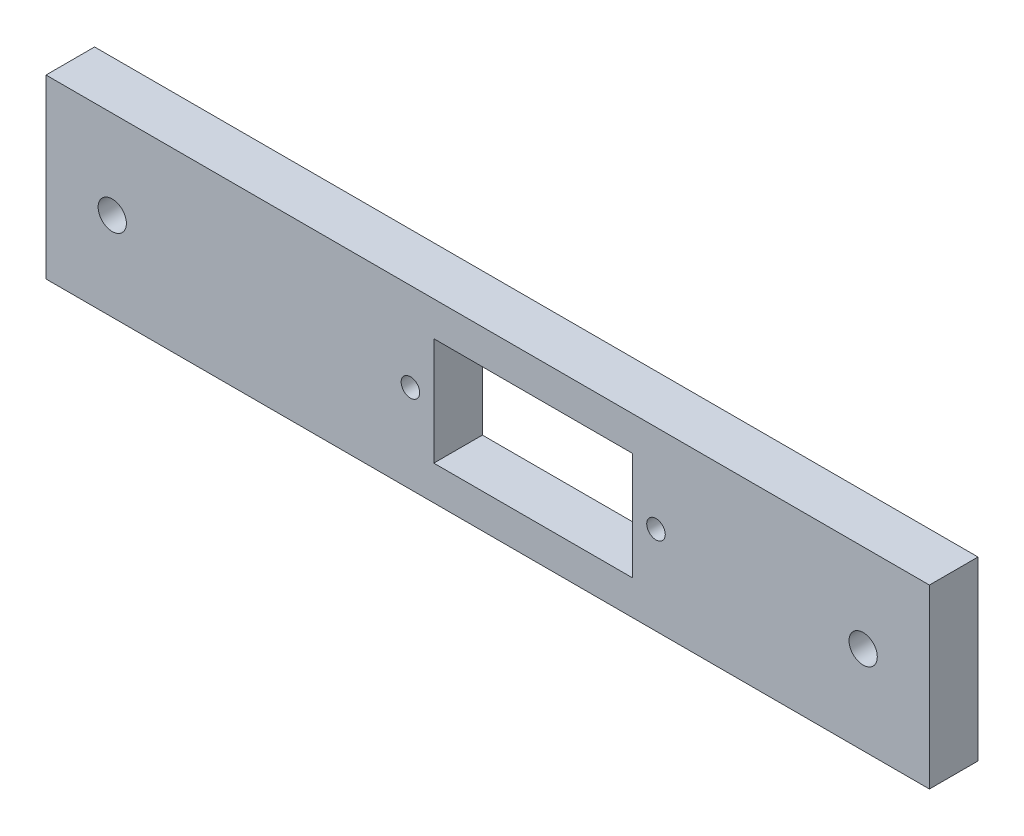
ISO-10303-21;
HEADER;
FILE_DESCRIPTION(('STEP AP214'),'2;1');
FILE_NAME('part.step','',(''),(''),'','','');
FILE_SCHEMA(('AUTOMOTIVE_DESIGN { 1 0 10303 214 1 1 1 1 }'));
ENDSEC;
DATA;
#1=APPLICATION_CONTEXT('core data for automotive mechanical design processes');
#2=APPLICATION_PROTOCOL_DEFINITION('international standard','automotive_design',2000,#1);
#3=PRODUCT_CONTEXT('',#1,'mechanical');
#4=PRODUCT('Part','Part','',(#3));
#5=PRODUCT_RELATED_PRODUCT_CATEGORY('part','',(#4));
#6=PRODUCT_DEFINITION_FORMATION('','',#4);
#7=PRODUCT_DEFINITION_CONTEXT('part definition',#1,'design');
#8=PRODUCT_DEFINITION('design','',#6,#7);
#9=PRODUCT_DEFINITION_SHAPE('','',#8);
#10=(LENGTH_UNIT() NAMED_UNIT(*) SI_UNIT(.MILLI.,.METRE.));
#11=(NAMED_UNIT(*) PLANE_ANGLE_UNIT() SI_UNIT($,.RADIAN.));
#12=(NAMED_UNIT(*) SI_UNIT($,.STERADIAN.) SOLID_ANGLE_UNIT());
#13=UNCERTAINTY_MEASURE_WITH_UNIT(LENGTH_MEASURE(1.E-05),#10,'distance_accuracy_value','');
#14=(GEOMETRIC_REPRESENTATION_CONTEXT(3) GLOBAL_UNCERTAINTY_ASSIGNED_CONTEXT((#13)) GLOBAL_UNIT_ASSIGNED_CONTEXT((#10,
#11,#12)) REPRESENTATION_CONTEXT('',''));
#15=CARTESIAN_POINT('',(0.,0.,0.));
#16=DIRECTION('',(0.,0.,1.));
#17=DIRECTION('',(1.,0.,0.));
#18=AXIS2_PLACEMENT_3D('',#15,#16,#17);
#19=CARTESIAN_POINT('',(50.,10.,5.5));
#20=DIRECTION('',(-1.,0.,0.));
#21=DIRECTION('',(0.,0.,1.));
#22=AXIS2_PLACEMENT_3D('',#19,#20,#21);
#23=PLANE('',#22);
#24=DIRECTION('',(0.,1.,0.));
#25=VECTOR('',#24,1.);
#26=CARTESIAN_POINT('',(50.,10.,0.));
#27=LINE('',#26,#25);
#28=CARTESIAN_POINT('',(50.,-10.,0.));
#29=VERTEX_POINT('',#28);
#30=CARTESIAN_POINT('',(50.,10.,0.));
#31=VERTEX_POINT('',#30);
#32=EDGE_CURVE('E134',#29,#31,#27,.T.);
#33=ORIENTED_EDGE('',*,*,#32,.T.);
#34=DIRECTION('',(0.,0.,-1.));
#35=VECTOR('',#34,1.);
#36=CARTESIAN_POINT('',(50.,10.,5.5));
#37=LINE('',#36,#35);
#38=CARTESIAN_POINT('',(50.,10.,5.5));
#39=VERTEX_POINT('',#38);
#40=EDGE_CURVE('E11',#39,#31,#37,.T.);
#41=ORIENTED_EDGE('',*,*,#40,.F.);
#42=DIRECTION('',(0.,1.,0.));
#43=VECTOR('',#42,1.);
#44=CARTESIAN_POINT('',(50.,10.,5.5));
#45=LINE('',#44,#43);
#46=CARTESIAN_POINT('',(50.,-10.,5.5));
#47=VERTEX_POINT('',#46);
#48=EDGE_CURVE('E138',#47,#39,#45,.T.);
#49=ORIENTED_EDGE('',*,*,#48,.F.);
#50=DIRECTION('',(0.,0.,-1.));
#51=VECTOR('',#50,1.);
#52=CARTESIAN_POINT('',(50.,-10.,5.5));
#53=LINE('',#52,#51);
#54=EDGE_CURVE('E148',#47,#29,#53,.T.);
#55=ORIENTED_EDGE('',*,*,#54,.T.);
#56=EDGE_LOOP('',(#33,#41,#49,#55));
#57=FACE_BOUND('',#56,.T.);
#58=ADVANCED_FACE('F33',(#57),#23,.F.);
#59=CARTESIAN_POINT('',(-50.,10.,5.5));
#60=DIRECTION('',(0.,-1.,0.));
#61=DIRECTION('',(0.,0.,-1.));
#62=AXIS2_PLACEMENT_3D('',#59,#60,#61);
#63=PLANE('',#62);
#64=DIRECTION('',(-1.,0.,0.));
#65=VECTOR('',#64,1.);
#66=CARTESIAN_POINT('',(-50.,10.,0.));
#67=LINE('',#66,#65);
#68=CARTESIAN_POINT('',(-50.,10.,0.));
#69=VERTEX_POINT('',#68);
#70=EDGE_CURVE('E151',#31,#69,#67,.T.);
#71=ORIENTED_EDGE('',*,*,#70,.T.);
#72=DIRECTION('',(0.,0.,-1.));
#73=VECTOR('',#72,1.);
#74=CARTESIAN_POINT('',(-50.,10.,5.5));
#75=LINE('',#74,#73);
#76=CARTESIAN_POINT('',(-50.,10.,5.5));
#77=VERTEX_POINT('',#76);
#78=EDGE_CURVE('E40',#77,#69,#75,.T.);
#79=ORIENTED_EDGE('',*,*,#78,.F.);
#80=DIRECTION('',(-1.,0.,0.));
#81=VECTOR('',#80,1.);
#82=CARTESIAN_POINT('',(-50.,10.,5.5));
#83=LINE('',#82,#81);
#84=EDGE_CURVE('E141',#39,#77,#83,.T.);
#85=ORIENTED_EDGE('',*,*,#84,.F.);
#86=ORIENTED_EDGE('',*,*,#40,.T.);
#87=EDGE_LOOP('',(#71,#79,#85,#86));
#88=FACE_BOUND('',#87,.T.);
#89=ADVANCED_FACE('F179',(#88),#63,.F.);
#90=CARTESIAN_POINT('',(-50.,10.,5.5));
#91=DIRECTION('',(1.,0.,0.));
#92=DIRECTION('',(0.,0.,-1.));
#93=AXIS2_PLACEMENT_3D('',#90,#91,#92);
#94=PLANE('',#93);
#95=DIRECTION('',(0.,-1.,0.));
#96=VECTOR('',#95,1.);
#97=CARTESIAN_POINT('',(-50.,10.,0.));
#98=LINE('',#97,#96);
#99=CARTESIAN_POINT('',(-50.,-10.,0.));
#100=VERTEX_POINT('',#99);
#101=EDGE_CURVE('E153',#69,#100,#98,.T.);
#102=ORIENTED_EDGE('',*,*,#101,.T.);
#103=DIRECTION('',(0.,0.,-1.));
#104=VECTOR('',#103,1.);
#105=CARTESIAN_POINT('',(-50.,-10.,5.5));
#106=LINE('',#105,#104);
#107=CARTESIAN_POINT('',(-50.,-10.,5.5));
#108=VERTEX_POINT('',#107);
#109=EDGE_CURVE('E158',#108,#100,#106,.T.);
#110=ORIENTED_EDGE('',*,*,#109,.F.);
#111=DIRECTION('',(0.,-1.,0.));
#112=VECTOR('',#111,1.);
#113=CARTESIAN_POINT('',(-50.,10.,5.5));
#114=LINE('',#113,#112);
#115=EDGE_CURVE('E144',#77,#108,#114,.T.);
#116=ORIENTED_EDGE('',*,*,#115,.F.);
#117=ORIENTED_EDGE('',*,*,#78,.T.);
#118=EDGE_LOOP('',(#102,#110,#116,#117));
#119=FACE_BOUND('',#118,.T.);
#120=ADVANCED_FACE('F165',(#119),#94,.F.);
#121=CARTESIAN_POINT('',(-50.,-10.,5.5));
#122=DIRECTION('',(0.,1.,0.));
#123=DIRECTION('',(0.,0.,1.));
#124=AXIS2_PLACEMENT_3D('',#121,#122,#123);
#125=PLANE('',#124);
#126=DIRECTION('',(1.,0.,0.));
#127=VECTOR('',#126,1.);
#128=CARTESIAN_POINT('',(-50.,-10.,0.));
#129=LINE('',#128,#127);
#130=EDGE_CURVE('E142',#100,#29,#129,.T.);
#131=ORIENTED_EDGE('',*,*,#130,.T.);
#132=ORIENTED_EDGE('',*,*,#54,.F.);
#133=DIRECTION('',(1.,0.,0.));
#134=VECTOR('',#133,1.);
#135=CARTESIAN_POINT('',(-50.,-10.,5.5));
#136=LINE('',#135,#134);
#137=EDGE_CURVE('E146',#108,#47,#136,.T.);
#138=ORIENTED_EDGE('',*,*,#137,.F.);
#139=ORIENTED_EDGE('',*,*,#109,.T.);
#140=EDGE_LOOP('',(#131,#132,#138,#139));
#141=FACE_BOUND('',#140,.T.);
#142=ADVANCED_FACE('F172',(#141),#125,.F.);
#143=CARTESIAN_POINT('',(0.,0.,5.5));
#144=DIRECTION('',(0.,0.,1.));
#145=DIRECTION('',(1.,0.,0.));
#146=AXIS2_PLACEMENT_3D('',#143,#144,#145);
#147=PLANE('',#146);
#148=CARTESIAN_POINT('',(-42.5,0.,5.5));
#149=DIRECTION('',(0.,0.,1.));
#150=DIRECTION('',(1.,0.,0.));
#151=AXIS2_PLACEMENT_3D('',#148,#149,#150);
#152=CIRCLE('',#151,1.6);
#153=CARTESIAN_POINT('',(-40.9,0.,5.5));
#154=VERTEX_POINT('',#153);
#155=EDGE_CURVE('E242',#154,#154,#152,.T.);
#156=ORIENTED_EDGE('',*,*,#155,.F.);
#157=EDGE_LOOP('',(#156));
#158=FACE_BOUND('',#157,.T.);
#159=CARTESIAN_POINT('',(42.5,0.,5.5));
#160=DIRECTION('',(0.,0.,1.));
#161=DIRECTION('',(1.,0.,0.));
#162=AXIS2_PLACEMENT_3D('',#159,#160,#161);
#163=CIRCLE('',#162,1.6);
#164=CARTESIAN_POINT('',(44.1,0.,5.5));
#165=VERTEX_POINT('',#164);
#166=EDGE_CURVE('E121',#165,#165,#163,.T.);
#167=ORIENTED_EDGE('',*,*,#166,.F.);
#168=EDGE_LOOP('',(#167));
#169=FACE_BOUND('',#168,.T.);
#170=CARTESIAN_POINT('',(-8.75,0.,5.5));
#171=DIRECTION('',(0.,0.,1.));
#172=DIRECTION('',(1.,0.,0.));
#173=AXIS2_PLACEMENT_3D('',#170,#171,#172);
#174=CIRCLE('',#173,1.05);
#175=CARTESIAN_POINT('',(-7.7,0.,5.5));
#176=VERTEX_POINT('',#175);
#177=EDGE_CURVE('E229',#176,#176,#174,.T.);
#178=ORIENTED_EDGE('',*,*,#177,.F.);
#179=EDGE_LOOP('',(#178));
#180=FACE_BOUND('',#179,.T.);
#181=CARTESIAN_POINT('',(19.05,0.,5.5));
#182=DIRECTION('',(0.,0.,1.));
#183=DIRECTION('',(1.,0.,0.));
#184=AXIS2_PLACEMENT_3D('',#181,#182,#183);
#185=CIRCLE('',#184,1.05);
#186=CARTESIAN_POINT('',(20.1,0.,5.5));
#187=VERTEX_POINT('',#186);
#188=EDGE_CURVE('E235',#187,#187,#185,.T.);
#189=ORIENTED_EDGE('',*,*,#188,.F.);
#190=EDGE_LOOP('',(#189));
#191=FACE_BOUND('',#190,.T.);
#192=DIRECTION('',(0.,1.,0.));
#193=VECTOR('',#192,1.);
#194=CARTESIAN_POINT('',(16.4,6.1,5.5));
#195=LINE('',#194,#193);
#196=CARTESIAN_POINT('',(16.4,-6.1,5.5));
#197=VERTEX_POINT('',#196);
#198=CARTESIAN_POINT('',(16.4,6.1,5.5));
#199=VERTEX_POINT('',#198);
#200=EDGE_CURVE('E47',#197,#199,#195,.T.);
#201=ORIENTED_EDGE('',*,*,#200,.F.);
#202=DIRECTION('',(1.,0.,0.));
#203=VECTOR('',#202,1.);
#204=CARTESIAN_POINT('',(-6.1,-6.1,5.5));
#205=LINE('',#204,#203);
#206=CARTESIAN_POINT('',(-6.1,-6.1,5.5));
#207=VERTEX_POINT('',#206);
#208=EDGE_CURVE('E115',#207,#197,#205,.T.);
#209=ORIENTED_EDGE('',*,*,#208,.F.);
#210=DIRECTION('',(0.,-1.,0.));
#211=VECTOR('',#210,1.);
#212=CARTESIAN_POINT('',(-6.1,6.1,5.5));
#213=LINE('',#212,#211);
#214=CARTESIAN_POINT('',(-6.1,6.1,5.5));
#215=VERTEX_POINT('',#214);
#216=EDGE_CURVE('E118',#215,#207,#213,.T.);
#217=ORIENTED_EDGE('',*,*,#216,.F.);
#218=DIRECTION('',(-1.,0.,0.));
#219=VECTOR('',#218,1.);
#220=CARTESIAN_POINT('',(-6.1,6.1,5.5));
#221=LINE('',#220,#219);
#222=EDGE_CURVE('E127',#199,#215,#221,.T.);
#223=ORIENTED_EDGE('',*,*,#222,.F.);
#224=EDGE_LOOP('',(#201,#209,#217,#223));
#225=FACE_BOUND('',#224,.T.);
#226=ORIENTED_EDGE('',*,*,#48,.T.);
#227=ORIENTED_EDGE('',*,*,#84,.T.);
#228=ORIENTED_EDGE('',*,*,#115,.T.);
#229=ORIENTED_EDGE('',*,*,#137,.T.);
#230=EDGE_LOOP('',(#226,#227,#228,#229));
#231=FACE_BOUND('',#230,.T.);
#232=ADVANCED_FACE('F178',(#158,#169,#180,#191,#225,#231),#147,.T.);
#233=CARTESIAN_POINT('',(0.,0.,0.));
#234=DIRECTION('',(0.,0.,1.));
#235=DIRECTION('',(1.,0.,0.));
#236=AXIS2_PLACEMENT_3D('',#233,#234,#235);
#237=PLANE('',#236);
#238=CARTESIAN_POINT('',(-42.5,0.,0.));
#239=DIRECTION('',(0.,0.,1.));
#240=DIRECTION('',(1.,0.,0.));
#241=AXIS2_PLACEMENT_3D('',#238,#239,#240);
#242=CIRCLE('',#241,1.6);
#243=CARTESIAN_POINT('',(-40.9,0.,0.));
#244=VERTEX_POINT('',#243);
#245=EDGE_CURVE('E128',#244,#244,#242,.T.);
#246=ORIENTED_EDGE('',*,*,#245,.T.);
#247=EDGE_LOOP('',(#246));
#248=FACE_BOUND('',#247,.T.);
#249=CARTESIAN_POINT('',(42.5,0.,0.));
#250=DIRECTION('',(0.,0.,1.));
#251=DIRECTION('',(1.,0.,0.));
#252=AXIS2_PLACEMENT_3D('',#249,#250,#251);
#253=CIRCLE('',#252,1.6);
#254=CARTESIAN_POINT('',(44.1,0.,0.));
#255=VERTEX_POINT('',#254);
#256=EDGE_CURVE('E244',#255,#255,#253,.T.);
#257=ORIENTED_EDGE('',*,*,#256,.T.);
#258=EDGE_LOOP('',(#257));
#259=FACE_BOUND('',#258,.T.);
#260=CARTESIAN_POINT('',(-8.75,0.,0.));
#261=DIRECTION('',(0.,0.,1.));
#262=DIRECTION('',(1.,0.,0.));
#263=AXIS2_PLACEMENT_3D('',#260,#261,#262);
#264=CIRCLE('',#263,1.05);
#265=CARTESIAN_POINT('',(-7.7,0.,0.));
#266=VERTEX_POINT('',#265);
#267=EDGE_CURVE('E226',#266,#266,#264,.T.);
#268=ORIENTED_EDGE('',*,*,#267,.T.);
#269=EDGE_LOOP('',(#268));
#270=FACE_BOUND('',#269,.T.);
#271=CARTESIAN_POINT('',(19.05,0.,0.));
#272=DIRECTION('',(0.,0.,1.));
#273=DIRECTION('',(1.,0.,0.));
#274=AXIS2_PLACEMENT_3D('',#271,#272,#273);
#275=CIRCLE('',#274,1.05);
#276=CARTESIAN_POINT('',(20.1,0.,0.));
#277=VERTEX_POINT('',#276);
#278=EDGE_CURVE('E231',#277,#277,#275,.T.);
#279=ORIENTED_EDGE('',*,*,#278,.T.);
#280=EDGE_LOOP('',(#279));
#281=FACE_BOUND('',#280,.T.);
#282=DIRECTION('',(1.,0.,0.));
#283=VECTOR('',#282,1.);
#284=CARTESIAN_POINT('',(-6.1,-6.1,0.));
#285=LINE('',#284,#283);
#286=CARTESIAN_POINT('',(-6.1,-6.1,0.));
#287=VERTEX_POINT('',#286);
#288=CARTESIAN_POINT('',(16.4,-6.1,0.));
#289=VERTEX_POINT('',#288);
#290=EDGE_CURVE('E105',#287,#289,#285,.T.);
#291=ORIENTED_EDGE('',*,*,#290,.T.);
#292=DIRECTION('',(0.,1.,0.));
#293=VECTOR('',#292,1.);
#294=CARTESIAN_POINT('',(16.4,6.1,0.));
#295=LINE('',#294,#293);
#296=CARTESIAN_POINT('',(16.4,6.1,0.));
#297=VERTEX_POINT('',#296);
#298=EDGE_CURVE('E99',#289,#297,#295,.T.);
#299=ORIENTED_EDGE('',*,*,#298,.T.);
#300=DIRECTION('',(-1.,0.,0.));
#301=VECTOR('',#300,1.);
#302=CARTESIAN_POINT('',(-6.1,6.1,0.));
#303=LINE('',#302,#301);
#304=CARTESIAN_POINT('',(-6.1,6.1,0.));
#305=VERTEX_POINT('',#304);
#306=EDGE_CURVE('E108',#297,#305,#303,.T.);
#307=ORIENTED_EDGE('',*,*,#306,.T.);
#308=DIRECTION('',(0.,-1.,0.));
#309=VECTOR('',#308,1.);
#310=CARTESIAN_POINT('',(-6.1,6.1,0.));
#311=LINE('',#310,#309);
#312=EDGE_CURVE('E55',#305,#287,#311,.T.);
#313=ORIENTED_EDGE('',*,*,#312,.T.);
#314=EDGE_LOOP('',(#291,#299,#307,#313));
#315=FACE_BOUND('',#314,.T.);
#316=ORIENTED_EDGE('',*,*,#32,.F.);
#317=ORIENTED_EDGE('',*,*,#130,.F.);
#318=ORIENTED_EDGE('',*,*,#101,.F.);
#319=ORIENTED_EDGE('',*,*,#70,.F.);
#320=EDGE_LOOP('',(#316,#317,#318,#319));
#321=FACE_BOUND('',#320,.T.);
#322=ADVANCED_FACE('F112',(#248,#259,#270,#281,#315,#321),#237,.F.);
#323=CARTESIAN_POINT('',(16.4,6.1,0.));
#324=DIRECTION('',(1.,0.,0.));
#325=DIRECTION('',(0.,1.,0.));
#326=AXIS2_PLACEMENT_3D('',#323,#324,#325);
#327=PLANE('',#326);
#328=ORIENTED_EDGE('',*,*,#200,.T.);
#329=DIRECTION('',(0.,0.,1.));
#330=VECTOR('',#329,1.);
#331=CARTESIAN_POINT('',(16.4,6.1,0.));
#332=LINE('',#331,#330);
#333=EDGE_CURVE('E95',#297,#199,#332,.T.);
#334=ORIENTED_EDGE('',*,*,#333,.F.);
#335=ORIENTED_EDGE('',*,*,#298,.F.);
#336=DIRECTION('',(0.,0.,1.));
#337=VECTOR('',#336,1.);
#338=CARTESIAN_POINT('',(16.4,-6.1,0.));
#339=LINE('',#338,#337);
#340=EDGE_CURVE('E132',#289,#197,#339,.T.);
#341=ORIENTED_EDGE('',*,*,#340,.T.);
#342=EDGE_LOOP('',(#328,#334,#335,#341));
#343=FACE_BOUND('',#342,.T.);
#344=ADVANCED_FACE('F97',(#343),#327,.F.);
#345=CARTESIAN_POINT('',(-6.1,-6.1,0.));
#346=DIRECTION('',(0.,-1.,0.));
#347=DIRECTION('',(0.,0.,-1.));
#348=AXIS2_PLACEMENT_3D('',#345,#346,#347);
#349=PLANE('',#348);
#350=ORIENTED_EDGE('',*,*,#208,.T.);
#351=ORIENTED_EDGE('',*,*,#340,.F.);
#352=ORIENTED_EDGE('',*,*,#290,.F.);
#353=DIRECTION('',(0.,0.,1.));
#354=VECTOR('',#353,1.);
#355=CARTESIAN_POINT('',(-6.1,-6.1,0.));
#356=LINE('',#355,#354);
#357=EDGE_CURVE('E135',#287,#207,#356,.T.);
#358=ORIENTED_EDGE('',*,*,#357,.T.);
#359=EDGE_LOOP('',(#350,#351,#352,#358));
#360=FACE_BOUND('',#359,.T.);
#361=ADVANCED_FACE('F197',(#360),#349,.F.);
#362=CARTESIAN_POINT('',(-6.1,6.1,0.));
#363=DIRECTION('',(-1.,0.,0.));
#364=DIRECTION('',(0.,0.,1.));
#365=AXIS2_PLACEMENT_3D('',#362,#363,#364);
#366=PLANE('',#365);
#367=ORIENTED_EDGE('',*,*,#216,.T.);
#368=ORIENTED_EDGE('',*,*,#357,.F.);
#369=ORIENTED_EDGE('',*,*,#312,.F.);
#370=DIRECTION('',(0.,0.,1.));
#371=VECTOR('',#370,1.);
#372=CARTESIAN_POINT('',(-6.1,6.1,0.));
#373=LINE('',#372,#371);
#374=EDGE_CURVE('E104',#305,#215,#373,.T.);
#375=ORIENTED_EDGE('',*,*,#374,.T.);
#376=EDGE_LOOP('',(#367,#368,#369,#375));
#377=FACE_BOUND('',#376,.T.);
#378=ADVANCED_FACE('F201',(#377),#366,.F.);
#379=CARTESIAN_POINT('',(-6.1,6.1,0.));
#380=DIRECTION('',(0.,1.,0.));
#381=DIRECTION('',(0.,0.,1.));
#382=AXIS2_PLACEMENT_3D('',#379,#380,#381);
#383=PLANE('',#382);
#384=ORIENTED_EDGE('',*,*,#222,.T.);
#385=ORIENTED_EDGE('',*,*,#374,.F.);
#386=ORIENTED_EDGE('',*,*,#306,.F.);
#387=ORIENTED_EDGE('',*,*,#333,.T.);
#388=EDGE_LOOP('',(#384,#385,#386,#387));
#389=FACE_BOUND('',#388,.T.);
#390=ADVANCED_FACE('F109',(#389),#383,.F.);
#391=CARTESIAN_POINT('',(19.05,0.,0.));
#392=DIRECTION('',(0.,0.,1.));
#393=DIRECTION('',(1.,0.,0.));
#394=AXIS2_PLACEMENT_3D('',#391,#392,#393);
#395=CYLINDRICAL_SURFACE('',#394,1.05);
#396=ORIENTED_EDGE('',*,*,#278,.F.);
#397=EDGE_LOOP('',(#396));
#398=FACE_BOUND('',#397,.T.);
#399=ORIENTED_EDGE('',*,*,#188,.T.);
#400=EDGE_LOOP('',(#399));
#401=FACE_BOUND('',#400,.T.);
#402=ADVANCED_FACE('F200',(#398,#401),#395,.F.);
#403=CARTESIAN_POINT('',(-8.75,0.,0.));
#404=DIRECTION('',(0.,0.,1.));
#405=DIRECTION('',(1.,0.,0.));
#406=AXIS2_PLACEMENT_3D('',#403,#404,#405);
#407=CYLINDRICAL_SURFACE('',#406,1.05);
#408=ORIENTED_EDGE('',*,*,#267,.F.);
#409=EDGE_LOOP('',(#408));
#410=FACE_BOUND('',#409,.T.);
#411=ORIENTED_EDGE('',*,*,#177,.T.);
#412=EDGE_LOOP('',(#411));
#413=FACE_BOUND('',#412,.T.);
#414=ADVANCED_FACE('F211',(#410,#413),#407,.F.);
#415=CARTESIAN_POINT('',(42.5,0.,0.));
#416=DIRECTION('',(0.,0.,1.));
#417=DIRECTION('',(1.,0.,0.));
#418=AXIS2_PLACEMENT_3D('',#415,#416,#417);
#419=CYLINDRICAL_SURFACE('',#418,1.6);
#420=ORIENTED_EDGE('',*,*,#256,.F.);
#421=EDGE_LOOP('',(#420));
#422=FACE_BOUND('',#421,.T.);
#423=ORIENTED_EDGE('',*,*,#166,.T.);
#424=EDGE_LOOP('',(#423));
#425=FACE_BOUND('',#424,.T.);
#426=ADVANCED_FACE('F207',(#422,#425),#419,.F.);
#427=CARTESIAN_POINT('',(-42.5,0.,0.));
#428=DIRECTION('',(0.,0.,1.));
#429=DIRECTION('',(1.,0.,0.));
#430=AXIS2_PLACEMENT_3D('',#427,#428,#429);
#431=CYLINDRICAL_SURFACE('',#430,1.6);
#432=ORIENTED_EDGE('',*,*,#245,.F.);
#433=EDGE_LOOP('',(#432));
#434=FACE_BOUND('',#433,.T.);
#435=ORIENTED_EDGE('',*,*,#155,.T.);
#436=EDGE_LOOP('',(#435));
#437=FACE_BOUND('',#436,.T.);
#438=ADVANCED_FACE('F210',(#434,#437),#431,.F.);
#439=CLOSED_SHELL('',(#58,#89,#120,#142,#232,#322,#344,#361,#378,#390,#402,#414,#426,#438));
#440=MANIFOLD_SOLID_BREP('B2',#439);
#441=ADVANCED_BREP_SHAPE_REPRESENTATION('',(#18,#440),#14);
#442=SHAPE_DEFINITION_REPRESENTATION(#9,#441);
ENDSEC;
END-ISO-10303-21;
